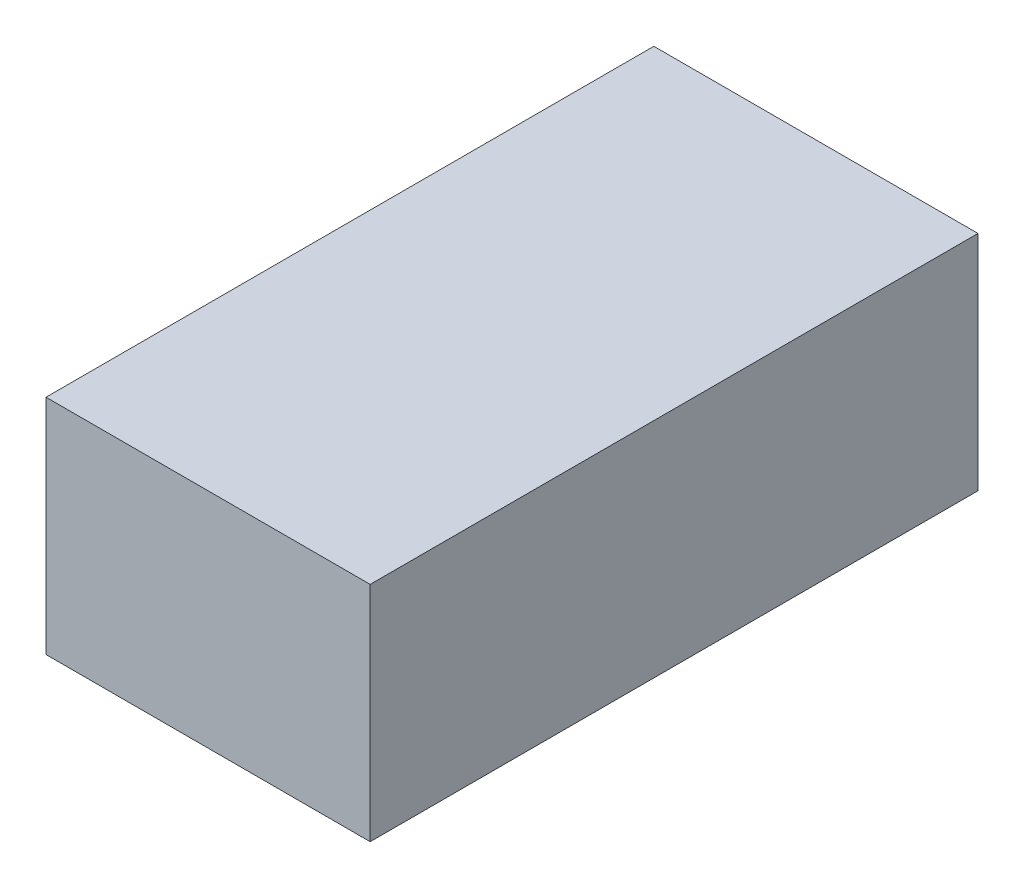
ISO-10303-21;
HEADER;
FILE_DESCRIPTION(('STEP AP214'),'2;1');
FILE_NAME('part.step','',(''),(''),'','','');
FILE_SCHEMA(('AUTOMOTIVE_DESIGN { 1 0 10303 214 1 1 1 1 }'));
ENDSEC;
DATA;
#1=APPLICATION_CONTEXT('core data for automotive mechanical design processes');
#2=APPLICATION_PROTOCOL_DEFINITION('international standard','automotive_design',2000,#1);
#3=PRODUCT_CONTEXT('',#1,'mechanical');
#4=PRODUCT('Part','Part','',(#3));
#5=PRODUCT_RELATED_PRODUCT_CATEGORY('part','',(#4));
#6=PRODUCT_DEFINITION_FORMATION('','',#4);
#7=PRODUCT_DEFINITION_CONTEXT('part definition',#1,'design');
#8=PRODUCT_DEFINITION('design','',#6,#7);
#9=PRODUCT_DEFINITION_SHAPE('','',#8);
#10=(LENGTH_UNIT() NAMED_UNIT(*) SI_UNIT(.MILLI.,.METRE.));
#11=(NAMED_UNIT(*) PLANE_ANGLE_UNIT() SI_UNIT($,.RADIAN.));
#12=(NAMED_UNIT(*) SI_UNIT($,.STERADIAN.) SOLID_ANGLE_UNIT());
#13=UNCERTAINTY_MEASURE_WITH_UNIT(LENGTH_MEASURE(1.E-05),#10,'distance_accuracy_value','');
#14=(GEOMETRIC_REPRESENTATION_CONTEXT(3) GLOBAL_UNCERTAINTY_ASSIGNED_CONTEXT((#13)) GLOBAL_UNIT_ASSIGNED_CONTEXT((#10,
#11,#12)) REPRESENTATION_CONTEXT('',''));
#15=CARTESIAN_POINT('',(0.,0.,0.));
#16=DIRECTION('',(0.,0.,1.));
#17=DIRECTION('',(1.,0.,0.));
#18=AXIS2_PLACEMENT_3D('',#15,#16,#17);
#19=CARTESIAN_POINT('',(0.,0.,150.));
#20=DIRECTION('',(1.,0.,0.));
#21=DIRECTION('',(0.,0.,-1.));
#22=AXIS2_PLACEMENT_3D('',#19,#20,#21);
#23=PLANE('',#22);
#24=DIRECTION('',(0.,-1.,0.));
#25=VECTOR('',#24,1.);
#26=CARTESIAN_POINT('',(0.,0.,0.));
#27=LINE('',#26,#25);
#28=CARTESIAN_POINT('',(0.,55.,0.));
#29=VERTEX_POINT('',#28);
#30=CARTESIAN_POINT('',(0.,0.,0.));
#31=VERTEX_POINT('',#30);
#32=EDGE_CURVE('E107',#29,#31,#27,.T.);
#33=ORIENTED_EDGE('',*,*,#32,.T.);
#34=DIRECTION('',(0.,0.,-1.));
#35=VECTOR('',#34,1.);
#36=CARTESIAN_POINT('',(0.,0.,150.));
#37=LINE('',#36,#35);
#38=CARTESIAN_POINT('',(0.,0.,150.));
#39=VERTEX_POINT('',#38);
#40=EDGE_CURVE('E11',#39,#31,#37,.T.);
#41=ORIENTED_EDGE('',*,*,#40,.F.);
#42=DIRECTION('',(0.,-1.,0.));
#43=VECTOR('',#42,1.);
#44=CARTESIAN_POINT('',(0.,0.,150.));
#45=LINE('',#44,#43);
#46=CARTESIAN_POINT('',(0.,55.,150.));
#47=VERTEX_POINT('',#46);
#48=EDGE_CURVE('E91',#47,#39,#45,.T.);
#49=ORIENTED_EDGE('',*,*,#48,.F.);
#50=DIRECTION('',(0.,0.,-1.));
#51=VECTOR('',#50,1.);
#52=CARTESIAN_POINT('',(0.,55.,150.));
#53=LINE('',#52,#51);
#54=EDGE_CURVE('E103',#47,#29,#53,.T.);
#55=ORIENTED_EDGE('',*,*,#54,.T.);
#56=EDGE_LOOP('',(#33,#41,#49,#55));
#57=FACE_BOUND('',#56,.T.);
#58=ADVANCED_FACE('F39',(#57),#23,.F.);
#59=CARTESIAN_POINT('',(0.,0.,150.));
#60=DIRECTION('',(0.,1.,0.));
#61=DIRECTION('',(0.,0.,1.));
#62=AXIS2_PLACEMENT_3D('',#59,#60,#61);
#63=PLANE('',#62);
#64=DIRECTION('',(1.,0.,0.));
#65=VECTOR('',#64,1.);
#66=CARTESIAN_POINT('',(0.,0.,0.));
#67=LINE('',#66,#65);
#68=CARTESIAN_POINT('',(80.,0.,0.));
#69=VERTEX_POINT('',#68);
#70=EDGE_CURVE('E96',#31,#69,#67,.T.);
#71=ORIENTED_EDGE('',*,*,#70,.T.);
#72=DIRECTION('',(0.,0.,-1.));
#73=VECTOR('',#72,1.);
#74=CARTESIAN_POINT('',(80.,0.,150.));
#75=LINE('',#74,#73);
#76=CARTESIAN_POINT('',(80.,0.,150.));
#77=VERTEX_POINT('',#76);
#78=EDGE_CURVE('E48',#77,#69,#75,.T.);
#79=ORIENTED_EDGE('',*,*,#78,.F.);
#80=DIRECTION('',(1.,0.,0.));
#81=VECTOR('',#80,1.);
#82=CARTESIAN_POINT('',(0.,0.,150.));
#83=LINE('',#82,#81);
#84=EDGE_CURVE('E86',#39,#77,#83,.T.);
#85=ORIENTED_EDGE('',*,*,#84,.F.);
#86=ORIENTED_EDGE('',*,*,#40,.T.);
#87=EDGE_LOOP('',(#71,#79,#85,#86));
#88=FACE_BOUND('',#87,.T.);
#89=ADVANCED_FACE('F95',(#88),#63,.F.);
#90=CARTESIAN_POINT('',(80.,0.,150.));
#91=DIRECTION('',(-1.,0.,0.));
#92=DIRECTION('',(0.,0.,1.));
#93=AXIS2_PLACEMENT_3D('',#90,#91,#92);
#94=PLANE('',#93);
#95=DIRECTION('',(0.,1.,0.));
#96=VECTOR('',#95,1.);
#97=CARTESIAN_POINT('',(80.,0.,0.));
#98=LINE('',#97,#96);
#99=CARTESIAN_POINT('',(80.,55.,0.));
#100=VERTEX_POINT('',#99);
#101=EDGE_CURVE('E73',#69,#100,#98,.T.);
#102=ORIENTED_EDGE('',*,*,#101,.T.);
#103=DIRECTION('',(0.,0.,-1.));
#104=VECTOR('',#103,1.);
#105=CARTESIAN_POINT('',(80.,55.,150.));
#106=LINE('',#105,#104);
#107=CARTESIAN_POINT('',(80.,55.,150.));
#108=VERTEX_POINT('',#107);
#109=EDGE_CURVE('E98',#108,#100,#106,.T.);
#110=ORIENTED_EDGE('',*,*,#109,.F.);
#111=DIRECTION('',(0.,1.,0.));
#112=VECTOR('',#111,1.);
#113=CARTESIAN_POINT('',(80.,0.,150.));
#114=LINE('',#113,#112);
#115=EDGE_CURVE('E89',#77,#108,#114,.T.);
#116=ORIENTED_EDGE('',*,*,#115,.F.);
#117=ORIENTED_EDGE('',*,*,#78,.T.);
#118=EDGE_LOOP('',(#102,#110,#116,#117));
#119=FACE_BOUND('',#118,.T.);
#120=ADVANCED_FACE('F99',(#119),#94,.F.);
#121=CARTESIAN_POINT('',(0.,55.,150.));
#122=DIRECTION('',(0.,-1.,0.));
#123=DIRECTION('',(0.,0.,-1.));
#124=AXIS2_PLACEMENT_3D('',#121,#122,#123);
#125=PLANE('',#124);
#126=DIRECTION('',(-1.,0.,0.));
#127=VECTOR('',#126,1.);
#128=CARTESIAN_POINT('',(0.,55.,0.));
#129=LINE('',#128,#127);
#130=EDGE_CURVE('E79',#100,#29,#129,.T.);
#131=ORIENTED_EDGE('',*,*,#130,.T.);
#132=ORIENTED_EDGE('',*,*,#54,.F.);
#133=DIRECTION('',(-1.,0.,0.));
#134=VECTOR('',#133,1.);
#135=CARTESIAN_POINT('',(0.,55.,150.));
#136=LINE('',#135,#134);
#137=EDGE_CURVE('E56',#108,#47,#136,.T.);
#138=ORIENTED_EDGE('',*,*,#137,.F.);
#139=ORIENTED_EDGE('',*,*,#109,.T.);
#140=EDGE_LOOP('',(#131,#132,#138,#139));
#141=FACE_BOUND('',#140,.T.);
#142=ADVANCED_FACE('F120',(#141),#125,.F.);
#143=CARTESIAN_POINT('',(0.,0.,150.));
#144=DIRECTION('',(0.,0.,-1.));
#145=DIRECTION('',(-1.,0.,0.));
#146=AXIS2_PLACEMENT_3D('',#143,#144,#145);
#147=PLANE('',#146);
#148=ORIENTED_EDGE('',*,*,#48,.T.);
#149=ORIENTED_EDGE('',*,*,#84,.T.);
#150=ORIENTED_EDGE('',*,*,#115,.T.);
#151=ORIENTED_EDGE('',*,*,#137,.T.);
#152=EDGE_LOOP('',(#148,#149,#150,#151));
#153=FACE_BOUND('',#152,.T.);
#154=ADVANCED_FACE('F87',(#153),#147,.F.);
#155=CARTESIAN_POINT('',(0.,0.,0.));
#156=DIRECTION('',(0.,0.,-1.));
#157=DIRECTION('',(-1.,0.,0.));
#158=AXIS2_PLACEMENT_3D('',#155,#156,#157);
#159=PLANE('',#158);
#160=ORIENTED_EDGE('',*,*,#32,.F.);
#161=ORIENTED_EDGE('',*,*,#130,.F.);
#162=ORIENTED_EDGE('',*,*,#101,.F.);
#163=ORIENTED_EDGE('',*,*,#70,.F.);
#164=EDGE_LOOP('',(#160,#161,#162,#163));
#165=FACE_BOUND('',#164,.T.);
#166=ADVANCED_FACE('F123',(#165),#159,.T.);
#167=CLOSED_SHELL('',(#58,#89,#120,#142,#154,#166));
#168=MANIFOLD_SOLID_BREP('B2',#167);
#169=ADVANCED_BREP_SHAPE_REPRESENTATION('',(#18,#168),#14);
#170=SHAPE_DEFINITION_REPRESENTATION(#9,#169);
ENDSEC;
END-ISO-10303-21;
